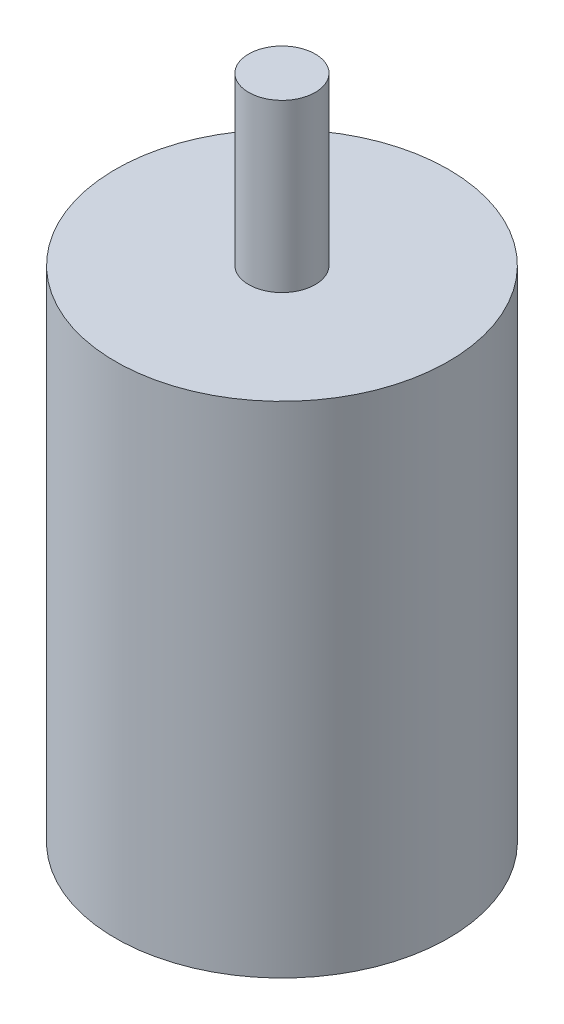
ISO-10303-21;
HEADER;
FILE_DESCRIPTION(('STEP AP214'),'2;1');
FILE_NAME('part.step','',(''),(''),'','','');
FILE_SCHEMA(('AUTOMOTIVE_DESIGN { 1 0 10303 214 1 1 1 1 }'));
ENDSEC;
DATA;
#1=APPLICATION_CONTEXT('core data for automotive mechanical design processes');
#2=APPLICATION_PROTOCOL_DEFINITION('international standard','automotive_design',2000,#1);
#3=PRODUCT_CONTEXT('',#1,'mechanical');
#4=PRODUCT('Part','Part','',(#3));
#5=PRODUCT_RELATED_PRODUCT_CATEGORY('part','',(#4));
#6=PRODUCT_DEFINITION_FORMATION('','',#4);
#7=PRODUCT_DEFINITION_CONTEXT('part definition',#1,'design');
#8=PRODUCT_DEFINITION('design','',#6,#7);
#9=PRODUCT_DEFINITION_SHAPE('','',#8);
#10=(LENGTH_UNIT() NAMED_UNIT(*) SI_UNIT(.MILLI.,.METRE.));
#11=(NAMED_UNIT(*) PLANE_ANGLE_UNIT() SI_UNIT($,.RADIAN.));
#12=(NAMED_UNIT(*) SI_UNIT($,.STERADIAN.) SOLID_ANGLE_UNIT());
#13=UNCERTAINTY_MEASURE_WITH_UNIT(LENGTH_MEASURE(1.E-05),#10,'distance_accuracy_value','');
#14=(GEOMETRIC_REPRESENTATION_CONTEXT(3) GLOBAL_UNCERTAINTY_ASSIGNED_CONTEXT((#13)) GLOBAL_UNIT_ASSIGNED_CONTEXT((#10,
#11,#12)) REPRESENTATION_CONTEXT('',''));
#15=CARTESIAN_POINT('',(0.,0.,0.));
#16=DIRECTION('',(0.,0.,1.));
#17=DIRECTION('',(1.,0.,0.));
#18=AXIS2_PLACEMENT_3D('',#15,#16,#17);
#19=CARTESIAN_POINT('',(0.,19.05,0.));
#20=DIRECTION('',(0.,-1.,0.));
#21=DIRECTION('',(0.,0.,-1.));
#22=AXIS2_PLACEMENT_3D('',#19,#20,#21);
#23=CYLINDRICAL_SURFACE('',#22,6.35);
#24=CARTESIAN_POINT('',(0.,19.05,0.));
#25=DIRECTION('',(0.,1.,0.));
#26=DIRECTION('',(0.,0.,1.));
#27=AXIS2_PLACEMENT_3D('',#24,#25,#26);
#28=CIRCLE('',#27,6.35);
#29=CARTESIAN_POINT('',(0.,19.05,-6.35));
#30=VERTEX_POINT('',#29);
#31=EDGE_CURVE('E37',#30,#30,#28,.T.);
#32=CARTESIAN_POINT('',(0.,0.,0.));
#33=DIRECTION('',(0.,1.,0.));
#34=DIRECTION('',(0.,0.,1.));
#35=AXIS2_PLACEMENT_3D('',#32,#33,#34);
#36=CIRCLE('',#35,6.35);
#37=CARTESIAN_POINT('',(0.,0.,-6.35));
#38=VERTEX_POINT('',#37);
#39=EDGE_CURVE('E33',#38,#38,#36,.T.);
#40=CARTESIAN_POINT('',(0.,19.05,-6.35));
#41=CARTESIAN_POINT('',(0.,18.8515625,-6.35));
#42=CARTESIAN_POINT('',(0.,18.653125,-6.35));
#43=CARTESIAN_POINT('',(0.,18.25625,-6.35));
#44=CARTESIAN_POINT('',(0.,18.0578125,-6.35));
#45=CARTESIAN_POINT('',(0.,17.6609375,-6.35));
#46=CARTESIAN_POINT('',(0.,17.4625,-6.35));
#47=CARTESIAN_POINT('',(0.,17.065625,-6.35));
#48=CARTESIAN_POINT('',(0.,16.8671875,-6.35));
#49=CARTESIAN_POINT('',(0.,16.4703125,-6.35));
#50=CARTESIAN_POINT('',(0.,16.271875,-6.35));
#51=CARTESIAN_POINT('',(0.,15.875,-6.35));
#52=CARTESIAN_POINT('',(0.,15.6765625,-6.35));
#53=CARTESIAN_POINT('',(0.,15.2796875,-6.35));
#54=CARTESIAN_POINT('',(0.,15.08125,-6.35));
#55=CARTESIAN_POINT('',(0.,14.684375,-6.35));
#56=CARTESIAN_POINT('',(0.,14.4859375,-6.35));
#57=CARTESIAN_POINT('',(0.,14.0890625,-6.35));
#58=CARTESIAN_POINT('',(0.,13.890625,-6.35));
#59=CARTESIAN_POINT('',(0.,13.49375,-6.35));
#60=CARTESIAN_POINT('',(0.,13.2953125,-6.35));
#61=CARTESIAN_POINT('',(0.,12.8984375,-6.35));
#62=CARTESIAN_POINT('',(0.,12.7,-6.35));
#63=CARTESIAN_POINT('',(0.,12.303125,-6.35));
#64=CARTESIAN_POINT('',(0.,12.1046875,-6.35));
#65=CARTESIAN_POINT('',(0.,11.7078125,-6.35));
#66=CARTESIAN_POINT('',(0.,11.509375,-6.35));
#67=CARTESIAN_POINT('',(0.,11.1125,-6.35));
#68=CARTESIAN_POINT('',(0.,10.9140625,-6.35));
#69=CARTESIAN_POINT('',(0.,10.5171875,-6.35));
#70=CARTESIAN_POINT('',(0.,10.31875,-6.35));
#71=CARTESIAN_POINT('',(0.,9.921875,-6.35));
#72=CARTESIAN_POINT('',(0.,9.7234375,-6.35));
#73=CARTESIAN_POINT('',(0.,9.3265625,-6.35));
#74=CARTESIAN_POINT('',(0.,9.128125,-6.35));
#75=CARTESIAN_POINT('',(0.,8.73125,-6.35));
#76=CARTESIAN_POINT('',(0.,8.5328125,-6.35));
#77=CARTESIAN_POINT('',(0.,8.1359375,-6.35));
#78=CARTESIAN_POINT('',(0.,7.9375,-6.35));
#79=CARTESIAN_POINT('',(0.,7.540625,-6.35));
#80=CARTESIAN_POINT('',(0.,7.3421875,-6.35));
#81=CARTESIAN_POINT('',(0.,6.9453125,-6.35));
#82=CARTESIAN_POINT('',(0.,6.746875,-6.35));
#83=CARTESIAN_POINT('',(0.,6.35,-6.35));
#84=CARTESIAN_POINT('',(0.,6.1515625,-6.35));
#85=CARTESIAN_POINT('',(0.,5.7546875,-6.35));
#86=CARTESIAN_POINT('',(0.,5.55625,-6.35));
#87=CARTESIAN_POINT('',(0.,5.159375,-6.35));
#88=CARTESIAN_POINT('',(0.,4.9609375,-6.35));
#89=CARTESIAN_POINT('',(0.,4.5640625,-6.35));
#90=CARTESIAN_POINT('',(0.,4.365625,-6.35));
#91=CARTESIAN_POINT('',(0.,3.96875,-6.35));
#92=CARTESIAN_POINT('',(0.,3.7703125,-6.35));
#93=CARTESIAN_POINT('',(0.,3.3734375,-6.35));
#94=CARTESIAN_POINT('',(0.,3.175,-6.35));
#95=CARTESIAN_POINT('',(0.,2.778125,-6.35));
#96=CARTESIAN_POINT('',(0.,2.5796875,-6.35));
#97=CARTESIAN_POINT('',(0.,2.1828125,-6.35));
#98=CARTESIAN_POINT('',(0.,1.984375,-6.35));
#99=CARTESIAN_POINT('',(0.,1.5875,-6.35));
#100=CARTESIAN_POINT('',(0.,1.3890625,-6.35));
#101=CARTESIAN_POINT('',(0.,0.992187500000001,-6.35));
#102=CARTESIAN_POINT('',(0.,0.793750000000001,-6.35));
#103=CARTESIAN_POINT('',(0.,0.396875,-6.35));
#104=CARTESIAN_POINT('',(0.,0.1984375,-6.35));
#105=CARTESIAN_POINT('',(0.,0.,-6.35));
#106=B_SPLINE_CURVE_WITH_KNOTS('',3,(#40,#41,#42,#43,#44,#45,#46,#47,#48,#49,#50,#51,#52,#53,
#54,#55,#56,#57,#58,#59,#60,#61,#62,#63,#64,#65,#66,#67,#68,#69,#70,#71,#72,#73,#74,#75,#76,#77,
#78,#79,#80,#81,#82,#83,#84,#85,#86,#87,#88,#89,#90,#91,#92,#93,#94,#95,#96,#97,#98,#99,#100,
#101,#102,#103,#104,#105),.UNSPECIFIED.,.F.,.F.,(4,2,2,2,2,2,2,2,2,2,2,2,2,2,2,2,2,2,2,2,2,2,2,
2,2,2,2,2,2,2,2,2,4),(0.,0.5953125,1.190625,1.7859375,2.38125,2.9765625,3.571875,4.1671875,
4.7625,5.3578125,5.953125,6.5484375,7.14375,7.7390625,8.334375,8.9296875,9.525,10.1203125,
10.715625,11.3109375,11.90625,12.5015625,13.096875,13.6921875,14.2875,14.8828125,15.478125,
16.0734375,16.66875,17.2640625,17.859375,18.4546875,19.05),.UNSPECIFIED.);
#107=EDGE_CURVE('BSEAM30',#30,#38,#106,.T.);
#108=ORIENTED_EDGE('',*,*,#31,.F.);
#109=ORIENTED_EDGE('',*,*,#39,.T.);
#110=ORIENTED_EDGE('',*,*,#107,.T.);
#111=ORIENTED_EDGE('',*,*,#107,.F.);
#112=EDGE_LOOP('',(#108,#110,#109,#111));
#113=FACE_BOUND('',#112,.T.);
#114=ADVANCED_FACE('F30',(#113),#23,.T.);
#115=CARTESIAN_POINT('',(0.,19.05,0.));
#116=DIRECTION('',(0.,1.,0.));
#117=DIRECTION('',(0.,0.,1.));
#118=AXIS2_PLACEMENT_3D('',#115,#116,#117);
#119=PLANE('',#118);
#120=CARTESIAN_POINT('',(0.,19.05,0.));
#121=DIRECTION('',(0.,1.,0.));
#122=DIRECTION('',(0.,0.,1.));
#123=AXIS2_PLACEMENT_3D('',#120,#121,#122);
#124=CIRCLE('',#123,1.27);
#125=CARTESIAN_POINT('',(0.,19.05,1.27));
#126=VERTEX_POINT('',#125);
#127=EDGE_CURVE('E10',#126,#126,#124,.T.);
#128=ORIENTED_EDGE('',*,*,#127,.F.);
#129=EDGE_LOOP('',(#128));
#130=FACE_BOUND('',#129,.T.);
#131=ORIENTED_EDGE('',*,*,#31,.T.);
#132=EDGE_LOOP('',(#131));
#133=FACE_BOUND('',#132,.T.);
#134=ADVANCED_FACE('F54',(#130,#133),#119,.T.);
#135=CARTESIAN_POINT('',(0.,0.,0.));
#136=DIRECTION('',(0.,1.,0.));
#137=DIRECTION('',(0.,0.,1.));
#138=AXIS2_PLACEMENT_3D('',#135,#136,#137);
#139=PLANE('',#138);
#140=ORIENTED_EDGE('',*,*,#39,.F.);
#141=EDGE_LOOP('',(#140));
#142=FACE_BOUND('',#141,.T.);
#143=ADVANCED_FACE('F51',(#142),#139,.F.);
#144=CARTESIAN_POINT('',(0.,25.4,0.));
#145=DIRECTION('',(0.,-1.,0.));
#146=DIRECTION('',(0.,0.,-1.));
#147=AXIS2_PLACEMENT_3D('',#144,#145,#146);
#148=CYLINDRICAL_SURFACE('',#147,1.27);
#149=CARTESIAN_POINT('',(0.,25.4,0.));
#150=DIRECTION('',(0.,1.,0.));
#151=DIRECTION('',(0.,0.,1.));
#152=AXIS2_PLACEMENT_3D('',#149,#150,#151);
#153=CIRCLE('',#152,1.27);
#154=CARTESIAN_POINT('',(0.,25.4,1.27));
#155=VERTEX_POINT('',#154);
#156=EDGE_CURVE('E43',#155,#155,#153,.T.);
#157=ORIENTED_EDGE('',*,*,#156,.F.);
#158=EDGE_LOOP('',(#157));
#159=FACE_BOUND('',#158,.T.);
#160=ORIENTED_EDGE('',*,*,#127,.T.);
#161=EDGE_LOOP('',(#160));
#162=FACE_BOUND('',#161,.T.);
#163=ADVANCED_FACE('F53',(#159,#162),#148,.T.);
#164=CARTESIAN_POINT('',(0.,25.4,0.));
#165=DIRECTION('',(0.,1.,0.));
#166=DIRECTION('',(0.,0.,1.));
#167=AXIS2_PLACEMENT_3D('',#164,#165,#166);
#168=PLANE('',#167);
#169=ORIENTED_EDGE('',*,*,#156,.T.);
#170=EDGE_LOOP('',(#169));
#171=FACE_BOUND('',#170,.T.);
#172=ADVANCED_FACE('F59',(#171),#168,.T.);
#173=CLOSED_SHELL('',(#114,#134,#143,#163,#172));
#174=MANIFOLD_SOLID_BREP('B2',#173);
#175=ADVANCED_BREP_SHAPE_REPRESENTATION('',(#18,#174),#14);
#176=SHAPE_DEFINITION_REPRESENTATION(#9,#175);
ENDSEC;
END-ISO-10303-21;
